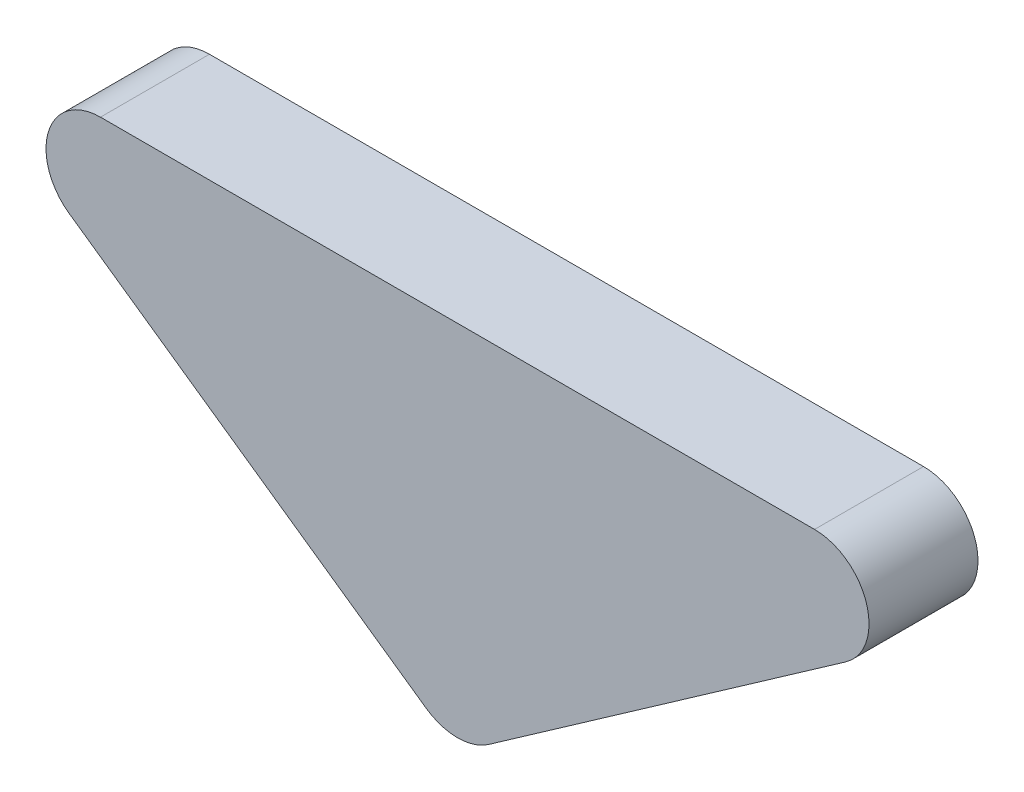
ISO-10303-21;
HEADER;
FILE_DESCRIPTION(('STEP AP214'),'2;1');
FILE_NAME('part.step','',(''),(''),'','','');
FILE_SCHEMA(('AUTOMOTIVE_DESIGN { 1 0 10303 214 1 1 1 1 }'));
ENDSEC;
DATA;
#1=APPLICATION_CONTEXT('core data for automotive mechanical design processes');
#2=APPLICATION_PROTOCOL_DEFINITION('international standard','automotive_design',2000,#1);
#3=PRODUCT_CONTEXT('',#1,'mechanical');
#4=PRODUCT('Part','Part','',(#3));
#5=PRODUCT_RELATED_PRODUCT_CATEGORY('part','',(#4));
#6=PRODUCT_DEFINITION_FORMATION('','',#4);
#7=PRODUCT_DEFINITION_CONTEXT('part definition',#1,'design');
#8=PRODUCT_DEFINITION('design','',#6,#7);
#9=PRODUCT_DEFINITION_SHAPE('','',#8);
#10=(LENGTH_UNIT() NAMED_UNIT(*) SI_UNIT(.MILLI.,.METRE.));
#11=(NAMED_UNIT(*) PLANE_ANGLE_UNIT() SI_UNIT($,.RADIAN.));
#12=(NAMED_UNIT(*) SI_UNIT($,.STERADIAN.) SOLID_ANGLE_UNIT());
#13=UNCERTAINTY_MEASURE_WITH_UNIT(LENGTH_MEASURE(1.E-05),#10,'distance_accuracy_value','');
#14=(GEOMETRIC_REPRESENTATION_CONTEXT(3) GLOBAL_UNCERTAINTY_ASSIGNED_CONTEXT((#13)) GLOBAL_UNIT_ASSIGNED_CONTEXT((#10,
#11,#12)) REPRESENTATION_CONTEXT('',''));
#15=CARTESIAN_POINT('',(0.,0.,0.));
#16=DIRECTION('',(0.,0.,1.));
#17=DIRECTION('',(1.,0.,0.));
#18=AXIS2_PLACEMENT_3D('',#15,#16,#17);
#19=CARTESIAN_POINT('',(-32.7660817715596,22.9430574540419,10.));
#20=DIRECTION('',(0.,0.,-1.));
#21=DIRECTION('',(-1.,0.,0.));
#22=AXIS2_PLACEMENT_3D('',#19,#20,#21);
#23=CYLINDRICAL_SURFACE('',#22,5.);
#24=CARTESIAN_POINT('',(-32.7660817715596,22.9430574540419,0.));
#25=DIRECTION('',(0.,0.,1.));
#26=DIRECTION('',(1.,0.,0.));
#27=AXIS2_PLACEMENT_3D('',#24,#25,#26);
#28=CIRCLE('',#27,5.);
#29=CARTESIAN_POINT('',(-32.7660817715596,27.9430574540419,0.));
#30=VERTEX_POINT('',#29);
#31=CARTESIAN_POINT('',(-35.6339639533149,18.8472972325969,0.));
#32=VERTEX_POINT('',#31);
#33=EDGE_CURVE('E119',#30,#32,#28,.T.);
#34=ORIENTED_EDGE('',*,*,#33,.T.);
#35=DIRECTION('',(0.,0.,-1.));
#36=VECTOR('',#35,1.);
#37=CARTESIAN_POINT('',(-35.6339639533149,18.8472972325969,10.));
#38=LINE('',#37,#36);
#39=CARTESIAN_POINT('',(-35.6339639533149,18.8472972325969,10.));
#40=VERTEX_POINT('',#39);
#41=EDGE_CURVE('E11',#40,#32,#38,.T.);
#42=ORIENTED_EDGE('',*,*,#41,.F.);
#43=CARTESIAN_POINT('',(-32.7660817715596,22.9430574540419,10.));
#44=DIRECTION('',(0.,0.,1.));
#45=DIRECTION('',(1.,0.,0.));
#46=AXIS2_PLACEMENT_3D('',#43,#44,#45);
#47=CIRCLE('',#46,5.);
#48=CARTESIAN_POINT('',(-32.7660817715596,27.9430574540419,10.));
#49=VERTEX_POINT('',#48);
#50=EDGE_CURVE('E129',#49,#40,#47,.T.);
#51=ORIENTED_EDGE('',*,*,#50,.F.);
#52=DIRECTION('',(0.,0.,-1.));
#53=VECTOR('',#52,1.);
#54=CARTESIAN_POINT('',(-32.7660817715596,27.9430574540419,10.));
#55=LINE('',#54,#53);
#56=EDGE_CURVE('E115',#49,#30,#55,.T.);
#57=ORIENTED_EDGE('',*,*,#56,.T.);
#58=EDGE_LOOP('',(#34,#42,#51,#57));
#59=FACE_BOUND('',#58,.T.);
#60=ADVANCED_FACE('F35',(#59),#23,.T.);
#61=CARTESIAN_POINT('',(-35.6339639533149,18.8472972325969,10.));
#62=DIRECTION('',(0.573576436351047,0.819152044288991,0.));
#63=DIRECTION('',(-0.819152044288991,0.573576436351047,0.));
#64=AXIS2_PLACEMENT_3D('',#61,#62,#63);
#65=PLANE('',#64);
#66=DIRECTION('',(0.819152044288991,-0.573576436351047,0.));
#67=VECTOR('',#66,1.);
#68=CARTESIAN_POINT('',(-35.6339639533149,18.8472972325969,0.));
#69=LINE('',#68,#67);
#70=CARTESIAN_POINT('',(-2.86788218175524,-4.09576022144496,0.));
#71=VERTEX_POINT('',#70);
#72=EDGE_CURVE('E122',#32,#71,#69,.T.);
#73=ORIENTED_EDGE('',*,*,#72,.T.);
#74=DIRECTION('',(0.,0.,-1.));
#75=VECTOR('',#74,1.);
#76=CARTESIAN_POINT('',(-2.86788218175524,-4.09576022144496,10.));
#77=LINE('',#76,#75);
#78=CARTESIAN_POINT('',(-2.86788218175524,-4.09576022144496,10.));
#79=VERTEX_POINT('',#78);
#80=EDGE_CURVE('E43',#79,#71,#77,.T.);
#81=ORIENTED_EDGE('',*,*,#80,.F.);
#82=DIRECTION('',(0.819152044288991,-0.573576436351047,0.));
#83=VECTOR('',#82,1.);
#84=CARTESIAN_POINT('',(-35.6339639533149,18.8472972325969,10.));
#85=LINE('',#84,#83);
#86=EDGE_CURVE('E88',#40,#79,#85,.T.);
#87=ORIENTED_EDGE('',*,*,#86,.F.);
#88=ORIENTED_EDGE('',*,*,#41,.T.);
#89=EDGE_LOOP('',(#73,#81,#87,#88));
#90=FACE_BOUND('',#89,.T.);
#91=ADVANCED_FACE('F153',(#90),#65,.F.);
#92=CARTESIAN_POINT('',(0.,0.,10.));
#93=DIRECTION('',(0.,0.,-1.));
#94=DIRECTION('',(-1.,0.,0.));
#95=AXIS2_PLACEMENT_3D('',#92,#93,#94);
#96=CYLINDRICAL_SURFACE('',#95,5.);
#97=CARTESIAN_POINT('',(0.,0.,0.));
#98=DIRECTION('',(0.,0.,1.));
#99=DIRECTION('',(1.,0.,0.));
#100=AXIS2_PLACEMENT_3D('',#97,#98,#99);
#101=CIRCLE('',#100,5.);
#102=CARTESIAN_POINT('',(2.86788218175524,-4.09576022144495,0.));
#103=VERTEX_POINT('',#102);
#104=EDGE_CURVE('E124',#71,#103,#101,.T.);
#105=ORIENTED_EDGE('',*,*,#104,.T.);
#106=DIRECTION('',(0.,0.,-1.));
#107=VECTOR('',#106,1.);
#108=CARTESIAN_POINT('',(2.86788218175524,-4.09576022144495,10.));
#109=LINE('',#108,#107);
#110=CARTESIAN_POINT('',(2.86788218175524,-4.09576022144495,10.));
#111=VERTEX_POINT('',#110);
#112=EDGE_CURVE('E110',#111,#103,#109,.T.);
#113=ORIENTED_EDGE('',*,*,#112,.F.);
#114=CARTESIAN_POINT('',(0.,0.,10.));
#115=DIRECTION('',(0.,0.,1.));
#116=DIRECTION('',(1.,0.,0.));
#117=AXIS2_PLACEMENT_3D('',#114,#115,#116);
#118=CIRCLE('',#117,5.);
#119=EDGE_CURVE('E101',#79,#111,#118,.T.);
#120=ORIENTED_EDGE('',*,*,#119,.F.);
#121=ORIENTED_EDGE('',*,*,#80,.T.);
#122=EDGE_LOOP('',(#105,#113,#120,#121));
#123=FACE_BOUND('',#122,.T.);
#124=ADVANCED_FACE('F135',(#123),#96,.T.);
#125=CARTESIAN_POINT('',(2.86788218175524,-4.09576022144495,10.));
#126=DIRECTION('',(-0.573576436351047,0.819152044288991,0.));
#127=DIRECTION('',(-0.819152044288991,-0.573576436351047,0.));
#128=AXIS2_PLACEMENT_3D('',#125,#126,#127);
#129=PLANE('',#128);
#130=DIRECTION('',(0.819152044288991,0.573576436351047,0.));
#131=VECTOR('',#130,1.);
#132=CARTESIAN_POINT('',(2.86788218175524,-4.09576022144495,0.));
#133=LINE('',#132,#131);
#134=CARTESIAN_POINT('',(35.6339639533149,18.8472972325969,0.));
#135=VERTEX_POINT('',#134);
#136=EDGE_CURVE('E109',#103,#135,#133,.T.);
#137=ORIENTED_EDGE('',*,*,#136,.T.);
#138=DIRECTION('',(0.,0.,-1.));
#139=VECTOR('',#138,1.);
#140=CARTESIAN_POINT('',(35.6339639533149,18.8472972325969,10.));
#141=LINE('',#140,#139);
#142=CARTESIAN_POINT('',(35.6339639533149,18.8472972325969,10.));
#143=VERTEX_POINT('',#142);
#144=EDGE_CURVE('E106',#143,#135,#141,.T.);
#145=ORIENTED_EDGE('',*,*,#144,.F.);
#146=DIRECTION('',(0.819152044288991,0.573576436351047,0.));
#147=VECTOR('',#146,1.);
#148=CARTESIAN_POINT('',(2.86788218175524,-4.09576022144495,10.));
#149=LINE('',#148,#147);
#150=EDGE_CURVE('E95',#111,#143,#149,.T.);
#151=ORIENTED_EDGE('',*,*,#150,.F.);
#152=ORIENTED_EDGE('',*,*,#112,.T.);
#153=EDGE_LOOP('',(#137,#145,#151,#152));
#154=FACE_BOUND('',#153,.T.);
#155=ADVANCED_FACE('F107',(#154),#129,.F.);
#156=CARTESIAN_POINT('',(32.7660817715596,22.9430574540419,10.));
#157=DIRECTION('',(0.,0.,-1.));
#158=DIRECTION('',(-1.,0.,0.));
#159=AXIS2_PLACEMENT_3D('',#156,#157,#158);
#160=CYLINDRICAL_SURFACE('',#159,5.);
#161=CARTESIAN_POINT('',(32.7660817715596,22.9430574540419,0.));
#162=DIRECTION('',(0.,0.,1.));
#163=DIRECTION('',(-1.,0.,0.));
#164=AXIS2_PLACEMENT_3D('',#161,#162,#163);
#165=CIRCLE('',#164,5.);
#166=CARTESIAN_POINT('',(32.7660817715596,27.9430574540419,0.));
#167=VERTEX_POINT('',#166);
#168=EDGE_CURVE('E74',#135,#167,#165,.T.);
#169=ORIENTED_EDGE('',*,*,#168,.T.);
#170=DIRECTION('',(0.,0.,-1.));
#171=VECTOR('',#170,1.);
#172=CARTESIAN_POINT('',(32.7660817715596,27.9430574540419,10.));
#173=LINE('',#172,#171);
#174=CARTESIAN_POINT('',(32.7660817715596,27.9430574540419,10.));
#175=VERTEX_POINT('',#174);
#176=EDGE_CURVE('E111',#175,#167,#173,.T.);
#177=ORIENTED_EDGE('',*,*,#176,.F.);
#178=CARTESIAN_POINT('',(32.7660817715596,22.9430574540419,10.));
#179=DIRECTION('',(0.,0.,1.));
#180=DIRECTION('',(-1.,0.,0.));
#181=AXIS2_PLACEMENT_3D('',#178,#179,#180);
#182=CIRCLE('',#181,5.);
#183=EDGE_CURVE('E99',#143,#175,#182,.T.);
#184=ORIENTED_EDGE('',*,*,#183,.F.);
#185=ORIENTED_EDGE('',*,*,#144,.T.);
#186=EDGE_LOOP('',(#169,#177,#184,#185));
#187=FACE_BOUND('',#186,.T.);
#188=ADVANCED_FACE('F113',(#187),#160,.T.);
#189=CARTESIAN_POINT('',(-32.7660817715596,27.9430574540419,10.));
#190=DIRECTION('',(0.,-1.,0.));
#191=DIRECTION('',(1.,0.,0.));
#192=AXIS2_PLACEMENT_3D('',#189,#190,#191);
#193=PLANE('',#192);
#194=DIRECTION('',(-1.,0.,0.));
#195=VECTOR('',#194,1.);
#196=CARTESIAN_POINT('',(-32.7660817715596,27.9430574540419,0.));
#197=LINE('',#196,#195);
#198=EDGE_CURVE('E80',#167,#30,#197,.T.);
#199=ORIENTED_EDGE('',*,*,#198,.T.);
#200=ORIENTED_EDGE('',*,*,#56,.F.);
#201=DIRECTION('',(-1.,0.,0.));
#202=VECTOR('',#201,1.);
#203=CARTESIAN_POINT('',(-32.7660817715596,27.9430574540419,10.));
#204=LINE('',#203,#202);
#205=EDGE_CURVE('E51',#175,#49,#204,.T.);
#206=ORIENTED_EDGE('',*,*,#205,.F.);
#207=ORIENTED_EDGE('',*,*,#176,.T.);
#208=EDGE_LOOP('',(#199,#200,#206,#207));
#209=FACE_BOUND('',#208,.T.);
#210=ADVANCED_FACE('F142',(#209),#193,.F.);
#211=CARTESIAN_POINT('',(-32.7660817715596,22.9430574540419,10.));
#212=DIRECTION('',(0.,0.,1.));
#213=DIRECTION('',(1.,0.,0.));
#214=AXIS2_PLACEMENT_3D('',#211,#212,#213);
#215=PLANE('',#214);
#216=ORIENTED_EDGE('',*,*,#50,.T.);
#217=ORIENTED_EDGE('',*,*,#86,.T.);
#218=ORIENTED_EDGE('',*,*,#119,.T.);
#219=ORIENTED_EDGE('',*,*,#150,.T.);
#220=ORIENTED_EDGE('',*,*,#183,.T.);
#221=ORIENTED_EDGE('',*,*,#205,.T.);
#222=EDGE_LOOP('',(#216,#217,#218,#219,#220,#221));
#223=FACE_BOUND('',#222,.T.);
#224=ADVANCED_FACE('F97',(#223),#215,.T.);
#225=CARTESIAN_POINT('',(-32.7660817715596,22.9430574540419,0.));
#226=DIRECTION('',(0.,0.,1.));
#227=DIRECTION('',(1.,0.,0.));
#228=AXIS2_PLACEMENT_3D('',#225,#226,#227);
#229=PLANE('',#228);
#230=ORIENTED_EDGE('',*,*,#33,.F.);
#231=ORIENTED_EDGE('',*,*,#198,.F.);
#232=ORIENTED_EDGE('',*,*,#168,.F.);
#233=ORIENTED_EDGE('',*,*,#136,.F.);
#234=ORIENTED_EDGE('',*,*,#104,.F.);
#235=ORIENTED_EDGE('',*,*,#72,.F.);
#236=EDGE_LOOP('',(#230,#231,#232,#233,#234,#235));
#237=FACE_BOUND('',#236,.T.);
#238=ADVANCED_FACE('F138',(#237),#229,.F.);
#239=CLOSED_SHELL('',(#60,#91,#124,#155,#188,#210,#224,#238));
#240=MANIFOLD_SOLID_BREP('B2',#239);
#241=ADVANCED_BREP_SHAPE_REPRESENTATION('',(#18,#240),#14);
#242=SHAPE_DEFINITION_REPRESENTATION(#9,#241);
ENDSEC;
END-ISO-10303-21;
